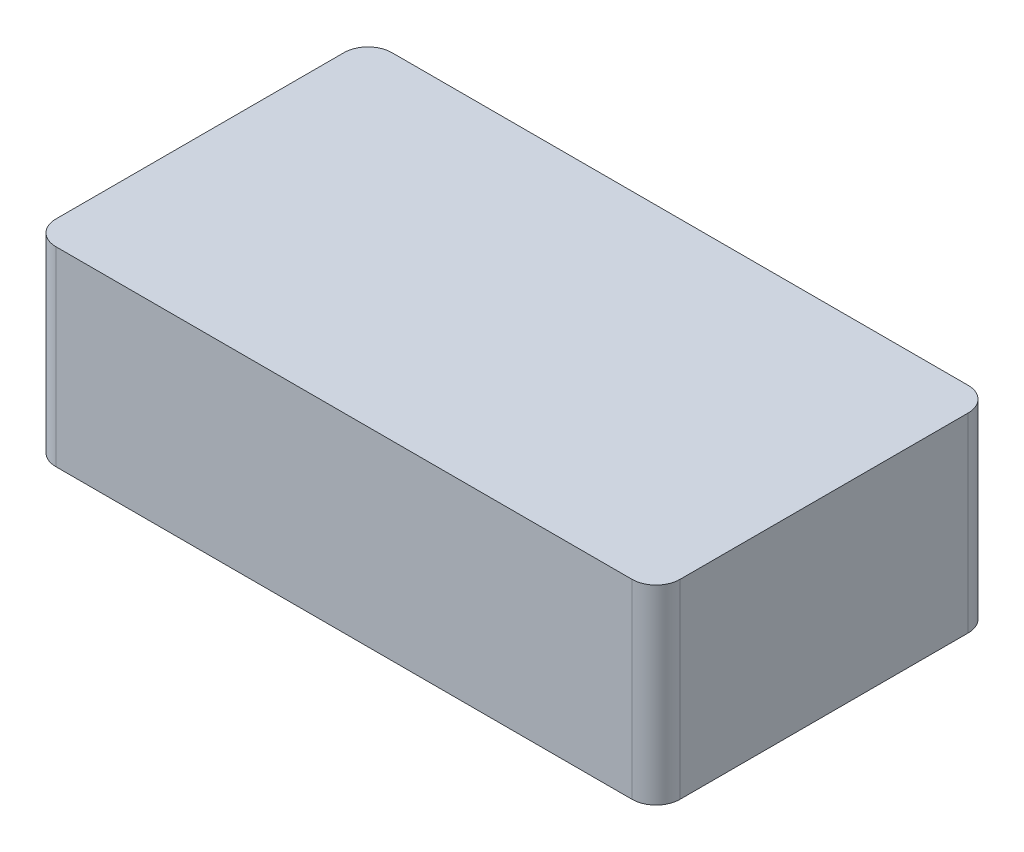
ISO-10303-21;
HEADER;
FILE_DESCRIPTION(('STEP AP214'),'2;1');
FILE_NAME('part.step','',(''),(''),'','','');
FILE_SCHEMA(('AUTOMOTIVE_DESIGN { 1 0 10303 214 1 1 1 1 }'));
ENDSEC;
DATA;
#1=APPLICATION_CONTEXT('core data for automotive mechanical design processes');
#2=APPLICATION_PROTOCOL_DEFINITION('international standard','automotive_design',2000,#1);
#3=PRODUCT_CONTEXT('',#1,'mechanical');
#4=PRODUCT('Part','Part','',(#3));
#5=PRODUCT_RELATED_PRODUCT_CATEGORY('part','',(#4));
#6=PRODUCT_DEFINITION_FORMATION('','',#4);
#7=PRODUCT_DEFINITION_CONTEXT('part definition',#1,'design');
#8=PRODUCT_DEFINITION('design','',#6,#7);
#9=PRODUCT_DEFINITION_SHAPE('','',#8);
#10=(LENGTH_UNIT() NAMED_UNIT(*) SI_UNIT(.MILLI.,.METRE.));
#11=(NAMED_UNIT(*) PLANE_ANGLE_UNIT() SI_UNIT($,.RADIAN.));
#12=(NAMED_UNIT(*) SI_UNIT($,.STERADIAN.) SOLID_ANGLE_UNIT());
#13=UNCERTAINTY_MEASURE_WITH_UNIT(LENGTH_MEASURE(1.E-05),#10,'distance_accuracy_value','');
#14=(GEOMETRIC_REPRESENTATION_CONTEXT(3) GLOBAL_UNCERTAINTY_ASSIGNED_CONTEXT((#13)) GLOBAL_UNIT_ASSIGNED_CONTEXT((#10,
#11,#12)) REPRESENTATION_CONTEXT('',''));
#15=CARTESIAN_POINT('',(0.,0.,0.));
#16=DIRECTION('',(0.,0.,1.));
#17=DIRECTION('',(1.,0.,0.));
#18=AXIS2_PLACEMENT_3D('',#15,#16,#17);
#19=CARTESIAN_POINT('',(0.,1.984375,0.));
#20=DIRECTION('',(1.,0.,0.));
#21=DIRECTION('',(0.,0.,-1.));
#22=AXIS2_PLACEMENT_3D('',#19,#20,#21);
#23=PLANE('',#22);
#24=DIRECTION('',(0.,0.,1.));
#25=VECTOR('',#24,1.);
#26=CARTESIAN_POINT('',(0.,1.984375,0.));
#27=LINE('',#26,#25);
#28=CARTESIAN_POINT('',(0.,1.984375,-3.25));
#29=VERTEX_POINT('',#28);
#30=CARTESIAN_POINT('',(0.,1.984375,-0.25));
#31=VERTEX_POINT('',#30);
#32=EDGE_CURVE('E124',#29,#31,#27,.T.);
#33=ORIENTED_EDGE('',*,*,#32,.F.);
#34=DIRECTION('',(0.,-1.,0.));
#35=VECTOR('',#34,1.);
#36=CARTESIAN_POINT('',(0.,1.984375,-3.25));
#37=LINE('',#36,#35);
#38=CARTESIAN_POINT('',(0.,0.,-3.25));
#39=VERTEX_POINT('',#38);
#40=EDGE_CURVE('E11',#29,#39,#37,.T.);
#41=ORIENTED_EDGE('',*,*,#40,.T.);
#42=DIRECTION('',(0.,0.,1.));
#43=VECTOR('',#42,1.);
#44=CARTESIAN_POINT('',(0.,0.,0.));
#45=LINE('',#44,#43);
#46=CARTESIAN_POINT('',(0.,0.,-0.25));
#47=VERTEX_POINT('',#46);
#48=EDGE_CURVE('E126',#39,#47,#45,.T.);
#49=ORIENTED_EDGE('',*,*,#48,.T.);
#50=DIRECTION('',(0.,-1.,0.));
#51=VECTOR('',#50,1.);
#52=CARTESIAN_POINT('',(0.,1.984375,-0.25));
#53=LINE('',#52,#51);
#54=EDGE_CURVE('E139',#47,#31,#53,.F.);
#55=ORIENTED_EDGE('',*,*,#54,.T.);
#56=EDGE_LOOP('',(#33,#41,#49,#55));
#57=FACE_BOUND('',#56,.T.);
#58=ADVANCED_FACE('F31',(#57),#23,.F.);
#59=CARTESIAN_POINT('',(0.,1.984375,0.));
#60=DIRECTION('',(0.,0.,-1.));
#61=DIRECTION('',(-1.,0.,0.));
#62=AXIS2_PLACEMENT_3D('',#59,#60,#61);
#63=PLANE('',#62);
#64=DIRECTION('',(1.,0.,0.));
#65=VECTOR('',#64,1.);
#66=CARTESIAN_POINT('',(0.,0.,0.));
#67=LINE('',#66,#65);
#68=CARTESIAN_POINT('',(0.25,0.,0.));
#69=VERTEX_POINT('',#68);
#70=CARTESIAN_POINT('',(6.25,0.,0.));
#71=VERTEX_POINT('',#70);
#72=EDGE_CURVE('E121',#69,#71,#67,.T.);
#73=ORIENTED_EDGE('',*,*,#72,.T.);
#74=DIRECTION('',(0.,-1.,0.));
#75=VECTOR('',#74,1.);
#76=CARTESIAN_POINT('',(6.25,1.984375,0.));
#77=LINE('',#76,#75);
#78=CARTESIAN_POINT('',(6.25,1.984375,0.));
#79=VERTEX_POINT('',#78);
#80=EDGE_CURVE('E104',#71,#79,#77,.F.);
#81=ORIENTED_EDGE('',*,*,#80,.T.);
#82=DIRECTION('',(1.,0.,0.));
#83=VECTOR('',#82,1.);
#84=CARTESIAN_POINT('',(0.,1.984375,0.));
#85=LINE('',#84,#83);
#86=CARTESIAN_POINT('',(0.25,1.984375,0.));
#87=VERTEX_POINT('',#86);
#88=EDGE_CURVE('E249',#87,#79,#85,.T.);
#89=ORIENTED_EDGE('',*,*,#88,.F.);
#90=DIRECTION('',(0.,-1.,0.));
#91=VECTOR('',#90,1.);
#92=CARTESIAN_POINT('',(0.25,1.984375,0.));
#93=LINE('',#92,#91);
#94=EDGE_CURVE('E109',#87,#69,#93,.T.);
#95=ORIENTED_EDGE('',*,*,#94,.T.);
#96=EDGE_LOOP('',(#73,#81,#89,#95));
#97=FACE_BOUND('',#96,.T.);
#98=ADVANCED_FACE('F171',(#97),#63,.F.);
#99=CARTESIAN_POINT('',(6.5,1.984375,0.));
#100=DIRECTION('',(-1.,0.,0.));
#101=DIRECTION('',(0.,0.,1.));
#102=AXIS2_PLACEMENT_3D('',#99,#100,#101);
#103=PLANE('',#102);
#104=DIRECTION('',(0.,0.,-1.));
#105=VECTOR('',#104,1.);
#106=CARTESIAN_POINT('',(6.5,0.,0.));
#107=LINE('',#106,#105);
#108=CARTESIAN_POINT('',(6.5,0.,-0.25));
#109=VERTEX_POINT('',#108);
#110=CARTESIAN_POINT('',(6.5,0.,-3.25));
#111=VERTEX_POINT('',#110);
#112=EDGE_CURVE('E113',#109,#111,#107,.T.);
#113=ORIENTED_EDGE('',*,*,#112,.T.);
#114=DIRECTION('',(0.,-1.,0.));
#115=VECTOR('',#114,1.);
#116=CARTESIAN_POINT('',(6.5,1.984375,-3.25));
#117=LINE('',#116,#115);
#118=CARTESIAN_POINT('',(6.5,1.984375,-3.25));
#119=VERTEX_POINT('',#118);
#120=EDGE_CURVE('E54',#111,#119,#117,.F.);
#121=ORIENTED_EDGE('',*,*,#120,.T.);
#122=DIRECTION('',(0.,0.,-1.));
#123=VECTOR('',#122,1.);
#124=CARTESIAN_POINT('',(6.5,1.984375,0.));
#125=LINE('',#124,#123);
#126=CARTESIAN_POINT('',(6.5,1.984375,-0.25));
#127=VERTEX_POINT('',#126);
#128=EDGE_CURVE('E114',#127,#119,#125,.T.);
#129=ORIENTED_EDGE('',*,*,#128,.F.);
#130=DIRECTION('',(0.,-1.,0.));
#131=VECTOR('',#130,1.);
#132=CARTESIAN_POINT('',(6.5,1.984375,-0.25));
#133=LINE('',#132,#131);
#134=EDGE_CURVE('E103',#127,#109,#133,.T.);
#135=ORIENTED_EDGE('',*,*,#134,.T.);
#136=EDGE_LOOP('',(#113,#121,#129,#135));
#137=FACE_BOUND('',#136,.T.);
#138=ADVANCED_FACE('F112',(#137),#103,.F.);
#139=CARTESIAN_POINT('',(0.,1.984375,-3.5));
#140=DIRECTION('',(0.,0.,1.));
#141=DIRECTION('',(1.,0.,0.));
#142=AXIS2_PLACEMENT_3D('',#139,#140,#141);
#143=PLANE('',#142);
#144=DIRECTION('',(-1.,0.,0.));
#145=VECTOR('',#144,1.);
#146=CARTESIAN_POINT('',(0.,1.984375,-3.5));
#147=LINE('',#146,#145);
#148=CARTESIAN_POINT('',(6.25,1.984375,-3.5));
#149=VERTEX_POINT('',#148);
#150=CARTESIAN_POINT('',(0.25,1.984375,-3.5));
#151=VERTEX_POINT('',#150);
#152=EDGE_CURVE('E115',#149,#151,#147,.T.);
#153=ORIENTED_EDGE('',*,*,#152,.F.);
#154=DIRECTION('',(0.,-1.,0.));
#155=VECTOR('',#154,1.);
#156=CARTESIAN_POINT('',(6.25,1.984375,-3.5));
#157=LINE('',#156,#155);
#158=CARTESIAN_POINT('',(6.25,0.,-3.5));
#159=VERTEX_POINT('',#158);
#160=EDGE_CURVE('E144',#149,#159,#157,.T.);
#161=ORIENTED_EDGE('',*,*,#160,.T.);
#162=DIRECTION('',(-1.,0.,0.));
#163=VECTOR('',#162,1.);
#164=CARTESIAN_POINT('',(0.,0.,-3.5));
#165=LINE('',#164,#163);
#166=CARTESIAN_POINT('',(0.25,0.,-3.5));
#167=VERTEX_POINT('',#166);
#168=EDGE_CURVE('E120',#159,#167,#165,.T.);
#169=ORIENTED_EDGE('',*,*,#168,.T.);
#170=DIRECTION('',(0.,-1.,0.));
#171=VECTOR('',#170,1.);
#172=CARTESIAN_POINT('',(0.25,1.984375,-3.5));
#173=LINE('',#172,#171);
#174=EDGE_CURVE('E142',#167,#151,#173,.F.);
#175=ORIENTED_EDGE('',*,*,#174,.T.);
#176=EDGE_LOOP('',(#153,#161,#169,#175));
#177=FACE_BOUND('',#176,.T.);
#178=ADVANCED_FACE('F157',(#177),#143,.F.);
#179=CARTESIAN_POINT('',(0.,1.984375,-3.5));
#180=DIRECTION('',(0.,-1.,0.));
#181=DIRECTION('',(0.,0.,-1.));
#182=AXIS2_PLACEMENT_3D('',#179,#180,#181);
#183=PLANE('',#182);
#184=ORIENTED_EDGE('',*,*,#128,.T.);
#185=CARTESIAN_POINT('',(6.25,1.984375,-3.25));
#186=DIRECTION('',(0.,-1.,0.));
#187=DIRECTION('',(0.,0.,-1.));
#188=AXIS2_PLACEMENT_3D('',#185,#186,#187);
#189=CIRCLE('',#188,0.25);
#190=EDGE_CURVE('E39',#119,#149,#189,.F.);
#191=ORIENTED_EDGE('',*,*,#190,.T.);
#192=ORIENTED_EDGE('',*,*,#152,.T.);
#193=CARTESIAN_POINT('',(0.25,1.984375,-3.25));
#194=DIRECTION('',(0.,-1.,0.));
#195=DIRECTION('',(0.,0.,-1.));
#196=AXIS2_PLACEMENT_3D('',#193,#194,#195);
#197=CIRCLE('',#196,0.25);
#198=EDGE_CURVE('E46',#151,#29,#197,.F.);
#199=ORIENTED_EDGE('',*,*,#198,.T.);
#200=ORIENTED_EDGE('',*,*,#32,.T.);
#201=CARTESIAN_POINT('',(0.25,1.984375,-0.25));
#202=DIRECTION('',(0.,-1.,0.));
#203=DIRECTION('',(0.,0.,-1.));
#204=AXIS2_PLACEMENT_3D('',#201,#202,#203);
#205=CIRCLE('',#204,0.25);
#206=EDGE_CURVE('E135',#31,#87,#205,.F.);
#207=ORIENTED_EDGE('',*,*,#206,.T.);
#208=ORIENTED_EDGE('',*,*,#88,.T.);
#209=CARTESIAN_POINT('',(6.25,1.984375,-0.25));
#210=DIRECTION('',(0.,-1.,0.));
#211=DIRECTION('',(0.,0.,-1.));
#212=AXIS2_PLACEMENT_3D('',#209,#210,#211);
#213=CIRCLE('',#212,0.25);
#214=EDGE_CURVE('E137',#79,#127,#213,.F.);
#215=ORIENTED_EDGE('',*,*,#214,.T.);
#216=EDGE_LOOP('',(#184,#191,#192,#199,#200,#207,#208,#215));
#217=FACE_BOUND('',#216,.T.);
#218=ADVANCED_FACE('F153',(#217),#183,.F.);
#219=CARTESIAN_POINT('',(0.,0.,-3.5));
#220=DIRECTION('',(0.,-1.,0.));
#221=DIRECTION('',(0.,0.,-1.));
#222=AXIS2_PLACEMENT_3D('',#219,#220,#221);
#223=PLANE('',#222);
#224=ORIENTED_EDGE('',*,*,#168,.F.);
#225=CARTESIAN_POINT('',(6.25,0.,-3.25));
#226=DIRECTION('',(0.,-1.,0.));
#227=DIRECTION('',(0.,0.,-1.));
#228=AXIS2_PLACEMENT_3D('',#225,#226,#227);
#229=CIRCLE('',#228,0.25);
#230=EDGE_CURVE('E119',#159,#111,#229,.T.);
#231=ORIENTED_EDGE('',*,*,#230,.T.);
#232=ORIENTED_EDGE('',*,*,#112,.F.);
#233=CARTESIAN_POINT('',(6.25,0.,-0.25));
#234=DIRECTION('',(0.,-1.,0.));
#235=DIRECTION('',(0.,0.,-1.));
#236=AXIS2_PLACEMENT_3D('',#233,#234,#235);
#237=CIRCLE('',#236,0.25);
#238=EDGE_CURVE('E99',#109,#71,#237,.T.);
#239=ORIENTED_EDGE('',*,*,#238,.T.);
#240=ORIENTED_EDGE('',*,*,#72,.F.);
#241=CARTESIAN_POINT('',(0.25,0.,-0.25));
#242=DIRECTION('',(0.,-1.,0.));
#243=DIRECTION('',(0.,0.,-1.));
#244=AXIS2_PLACEMENT_3D('',#241,#242,#243);
#245=CIRCLE('',#244,0.25);
#246=EDGE_CURVE('E110',#69,#47,#245,.T.);
#247=ORIENTED_EDGE('',*,*,#246,.T.);
#248=ORIENTED_EDGE('',*,*,#48,.F.);
#249=CARTESIAN_POINT('',(0.25,0.,-3.25));
#250=DIRECTION('',(0.,-1.,0.));
#251=DIRECTION('',(0.,0.,-1.));
#252=AXIS2_PLACEMENT_3D('',#249,#250,#251);
#253=CIRCLE('',#252,0.25);
#254=EDGE_CURVE('E147',#39,#167,#253,.T.);
#255=ORIENTED_EDGE('',*,*,#254,.T.);
#256=EDGE_LOOP('',(#224,#231,#232,#239,#240,#247,#248,#255));
#257=FACE_BOUND('',#256,.T.);
#258=ADVANCED_FACE('F118',(#257),#223,.T.);
#259=CARTESIAN_POINT('',(6.25,1.984375,-0.25));
#260=DIRECTION('',(0.,-1.,0.));
#261=DIRECTION('',(0.,0.,-1.));
#262=AXIS2_PLACEMENT_3D('',#259,#260,#261);
#263=CYLINDRICAL_SURFACE('',#262,0.25);
#264=ORIENTED_EDGE('',*,*,#214,.F.);
#265=ORIENTED_EDGE('',*,*,#80,.F.);
#266=ORIENTED_EDGE('',*,*,#238,.F.);
#267=ORIENTED_EDGE('',*,*,#134,.F.);
#268=EDGE_LOOP('',(#264,#265,#266,#267));
#269=FACE_BOUND('',#268,.T.);
#270=ADVANCED_FACE('F102',(#269),#263,.T.);
#271=CARTESIAN_POINT('',(0.25,1.984375,-0.25));
#272=DIRECTION('',(0.,-1.,0.));
#273=DIRECTION('',(0.,0.,-1.));
#274=AXIS2_PLACEMENT_3D('',#271,#272,#273);
#275=CYLINDRICAL_SURFACE('',#274,0.25);
#276=ORIENTED_EDGE('',*,*,#206,.F.);
#277=ORIENTED_EDGE('',*,*,#54,.F.);
#278=ORIENTED_EDGE('',*,*,#246,.F.);
#279=ORIENTED_EDGE('',*,*,#94,.F.);
#280=EDGE_LOOP('',(#276,#277,#278,#279));
#281=FACE_BOUND('',#280,.T.);
#282=ADVANCED_FACE('F162',(#281),#275,.T.);
#283=CARTESIAN_POINT('',(6.25,1.984375,-3.25));
#284=DIRECTION('',(0.,-1.,0.));
#285=DIRECTION('',(0.,0.,-1.));
#286=AXIS2_PLACEMENT_3D('',#283,#284,#285);
#287=CYLINDRICAL_SURFACE('',#286,0.25);
#288=ORIENTED_EDGE('',*,*,#190,.F.);
#289=ORIENTED_EDGE('',*,*,#120,.F.);
#290=ORIENTED_EDGE('',*,*,#230,.F.);
#291=ORIENTED_EDGE('',*,*,#160,.F.);
#292=EDGE_LOOP('',(#288,#289,#290,#291));
#293=FACE_BOUND('',#292,.T.);
#294=ADVANCED_FACE('F160',(#293),#287,.T.);
#295=CARTESIAN_POINT('',(0.25,1.984375,-3.25));
#296=DIRECTION('',(0.,-1.,0.));
#297=DIRECTION('',(0.,0.,-1.));
#298=AXIS2_PLACEMENT_3D('',#295,#296,#297);
#299=CYLINDRICAL_SURFACE('',#298,0.25);
#300=ORIENTED_EDGE('',*,*,#198,.F.);
#301=ORIENTED_EDGE('',*,*,#174,.F.);
#302=ORIENTED_EDGE('',*,*,#254,.F.);
#303=ORIENTED_EDGE('',*,*,#40,.F.);
#304=EDGE_LOOP('',(#300,#301,#302,#303));
#305=FACE_BOUND('',#304,.T.);
#306=ADVANCED_FACE('F33',(#305),#299,.T.);
#307=CLOSED_SHELL('',(#58,#98,#138,#178,#218,#258,#270,#282,#294,#306));
#308=MANIFOLD_SOLID_BREP('B2',#307);
#309=ADVANCED_BREP_SHAPE_REPRESENTATION('',(#18,#308),#14);
#310=SHAPE_DEFINITION_REPRESENTATION(#9,#309);
ENDSEC;
END-ISO-10303-21;
